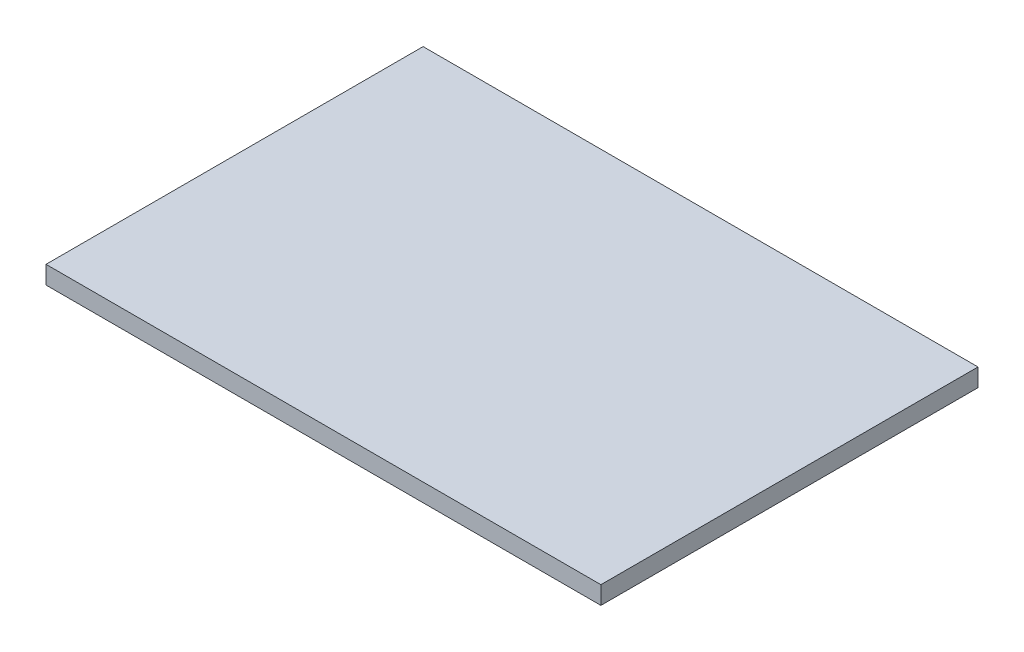
ISO-10303-21;
HEADER;
FILE_DESCRIPTION(('STEP AP214'),'2;1');
FILE_NAME('part.step','',(''),(''),'','','');
FILE_SCHEMA(('AUTOMOTIVE_DESIGN { 1 0 10303 214 1 1 1 1 }'));
ENDSEC;
DATA;
#1=APPLICATION_CONTEXT('core data for automotive mechanical design processes');
#2=APPLICATION_PROTOCOL_DEFINITION('international standard','automotive_design',2000,#1);
#3=PRODUCT_CONTEXT('',#1,'mechanical');
#4=PRODUCT('Part','Part','',(#3));
#5=PRODUCT_RELATED_PRODUCT_CATEGORY('part','',(#4));
#6=PRODUCT_DEFINITION_FORMATION('','',#4);
#7=PRODUCT_DEFINITION_CONTEXT('part definition',#1,'design');
#8=PRODUCT_DEFINITION('design','',#6,#7);
#9=PRODUCT_DEFINITION_SHAPE('','',#8);
#10=(LENGTH_UNIT() NAMED_UNIT(*) SI_UNIT(.MILLI.,.METRE.));
#11=(NAMED_UNIT(*) PLANE_ANGLE_UNIT() SI_UNIT($,.RADIAN.));
#12=(NAMED_UNIT(*) SI_UNIT($,.STERADIAN.) SOLID_ANGLE_UNIT());
#13=UNCERTAINTY_MEASURE_WITH_UNIT(LENGTH_MEASURE(1.E-05),#10,'distance_accuracy_value','');
#14=(GEOMETRIC_REPRESENTATION_CONTEXT(3) GLOBAL_UNCERTAINTY_ASSIGNED_CONTEXT((#13)) GLOBAL_UNIT_ASSIGNED_CONTEXT((#10,
#11,#12)) REPRESENTATION_CONTEXT('',''));
#15=CARTESIAN_POINT('',(0.,0.,0.));
#16=DIRECTION('',(0.,0.,1.));
#17=DIRECTION('',(1.,0.,0.));
#18=AXIS2_PLACEMENT_3D('',#15,#16,#17);
#19=CARTESIAN_POINT('',(0.,10.,0.));
#20=DIRECTION('',(1.,0.,0.));
#21=DIRECTION('',(0.,0.,-1.));
#22=AXIS2_PLACEMENT_3D('',#19,#20,#21);
#23=PLANE('',#22);
#24=DIRECTION('',(0.,0.,1.));
#25=VECTOR('',#24,1.);
#26=CARTESIAN_POINT('',(0.,0.,0.));
#27=LINE('',#26,#25);
#28=CARTESIAN_POINT('',(0.,0.,-210.));
#29=VERTEX_POINT('',#28);
#30=CARTESIAN_POINT('',(0.,0.,0.));
#31=VERTEX_POINT('',#30);
#32=EDGE_CURVE('E107',#29,#31,#27,.T.);
#33=ORIENTED_EDGE('',*,*,#32,.T.);
#34=DIRECTION('',(0.,-1.,0.));
#35=VECTOR('',#34,1.);
#36=CARTESIAN_POINT('',(0.,10.,0.));
#37=LINE('',#36,#35);
#38=CARTESIAN_POINT('',(0.,10.,0.));
#39=VERTEX_POINT('',#38);
#40=EDGE_CURVE('E11',#39,#31,#37,.T.);
#41=ORIENTED_EDGE('',*,*,#40,.F.);
#42=DIRECTION('',(0.,0.,1.));
#43=VECTOR('',#42,1.);
#44=CARTESIAN_POINT('',(0.,10.,0.));
#45=LINE('',#44,#43);
#46=CARTESIAN_POINT('',(0.,10.,-210.));
#47=VERTEX_POINT('',#46);
#48=EDGE_CURVE('E91',#47,#39,#45,.T.);
#49=ORIENTED_EDGE('',*,*,#48,.F.);
#50=DIRECTION('',(0.,-1.,0.));
#51=VECTOR('',#50,1.);
#52=CARTESIAN_POINT('',(0.,10.,-210.));
#53=LINE('',#52,#51);
#54=EDGE_CURVE('E103',#47,#29,#53,.T.);
#55=ORIENTED_EDGE('',*,*,#54,.T.);
#56=EDGE_LOOP('',(#33,#41,#49,#55));
#57=FACE_BOUND('',#56,.T.);
#58=ADVANCED_FACE('F39',(#57),#23,.F.);
#59=CARTESIAN_POINT('',(0.,10.,0.));
#60=DIRECTION('',(0.,0.,-1.));
#61=DIRECTION('',(-1.,0.,0.));
#62=AXIS2_PLACEMENT_3D('',#59,#60,#61);
#63=PLANE('',#62);
#64=DIRECTION('',(1.,0.,0.));
#65=VECTOR('',#64,1.);
#66=CARTESIAN_POINT('',(0.,0.,0.));
#67=LINE('',#66,#65);
#68=CARTESIAN_POINT('',(309.,0.,0.));
#69=VERTEX_POINT('',#68);
#70=EDGE_CURVE('E96',#31,#69,#67,.T.);
#71=ORIENTED_EDGE('',*,*,#70,.T.);
#72=DIRECTION('',(0.,-1.,0.));
#73=VECTOR('',#72,1.);
#74=CARTESIAN_POINT('',(309.,10.,0.));
#75=LINE('',#74,#73);
#76=CARTESIAN_POINT('',(309.,10.,0.));
#77=VERTEX_POINT('',#76);
#78=EDGE_CURVE('E48',#77,#69,#75,.T.);
#79=ORIENTED_EDGE('',*,*,#78,.F.);
#80=DIRECTION('',(1.,0.,0.));
#81=VECTOR('',#80,1.);
#82=CARTESIAN_POINT('',(0.,10.,0.));
#83=LINE('',#82,#81);
#84=EDGE_CURVE('E86',#39,#77,#83,.T.);
#85=ORIENTED_EDGE('',*,*,#84,.F.);
#86=ORIENTED_EDGE('',*,*,#40,.T.);
#87=EDGE_LOOP('',(#71,#79,#85,#86));
#88=FACE_BOUND('',#87,.T.);
#89=ADVANCED_FACE('F95',(#88),#63,.F.);
#90=CARTESIAN_POINT('',(309.,10.,0.));
#91=DIRECTION('',(-1.,0.,0.));
#92=DIRECTION('',(0.,0.,1.));
#93=AXIS2_PLACEMENT_3D('',#90,#91,#92);
#94=PLANE('',#93);
#95=DIRECTION('',(0.,0.,-1.));
#96=VECTOR('',#95,1.);
#97=CARTESIAN_POINT('',(309.,0.,0.));
#98=LINE('',#97,#96);
#99=CARTESIAN_POINT('',(309.,0.,-210.));
#100=VERTEX_POINT('',#99);
#101=EDGE_CURVE('E73',#69,#100,#98,.T.);
#102=ORIENTED_EDGE('',*,*,#101,.T.);
#103=DIRECTION('',(0.,-1.,0.));
#104=VECTOR('',#103,1.);
#105=CARTESIAN_POINT('',(309.,10.,-210.));
#106=LINE('',#105,#104);
#107=CARTESIAN_POINT('',(309.,10.,-210.));
#108=VERTEX_POINT('',#107);
#109=EDGE_CURVE('E98',#108,#100,#106,.T.);
#110=ORIENTED_EDGE('',*,*,#109,.F.);
#111=DIRECTION('',(0.,0.,-1.));
#112=VECTOR('',#111,1.);
#113=CARTESIAN_POINT('',(309.,10.,0.));
#114=LINE('',#113,#112);
#115=EDGE_CURVE('E89',#77,#108,#114,.T.);
#116=ORIENTED_EDGE('',*,*,#115,.F.);
#117=ORIENTED_EDGE('',*,*,#78,.T.);
#118=EDGE_LOOP('',(#102,#110,#116,#117));
#119=FACE_BOUND('',#118,.T.);
#120=ADVANCED_FACE('F99',(#119),#94,.F.);
#121=CARTESIAN_POINT('',(0.,10.,-210.));
#122=DIRECTION('',(0.,0.,1.));
#123=DIRECTION('',(1.,0.,0.));
#124=AXIS2_PLACEMENT_3D('',#121,#122,#123);
#125=PLANE('',#124);
#126=DIRECTION('',(-1.,0.,0.));
#127=VECTOR('',#126,1.);
#128=CARTESIAN_POINT('',(0.,0.,-210.));
#129=LINE('',#128,#127);
#130=EDGE_CURVE('E79',#100,#29,#129,.T.);
#131=ORIENTED_EDGE('',*,*,#130,.T.);
#132=ORIENTED_EDGE('',*,*,#54,.F.);
#133=DIRECTION('',(-1.,0.,0.));
#134=VECTOR('',#133,1.);
#135=CARTESIAN_POINT('',(0.,10.,-210.));
#136=LINE('',#135,#134);
#137=EDGE_CURVE('E56',#108,#47,#136,.T.);
#138=ORIENTED_EDGE('',*,*,#137,.F.);
#139=ORIENTED_EDGE('',*,*,#109,.T.);
#140=EDGE_LOOP('',(#131,#132,#138,#139));
#141=FACE_BOUND('',#140,.T.);
#142=ADVANCED_FACE('F120',(#141),#125,.F.);
#143=CARTESIAN_POINT('',(0.,10.,0.));
#144=DIRECTION('',(0.,-1.,0.));
#145=DIRECTION('',(0.,0.,-1.));
#146=AXIS2_PLACEMENT_3D('',#143,#144,#145);
#147=PLANE('',#146);
#148=ORIENTED_EDGE('',*,*,#48,.T.);
#149=ORIENTED_EDGE('',*,*,#84,.T.);
#150=ORIENTED_EDGE('',*,*,#115,.T.);
#151=ORIENTED_EDGE('',*,*,#137,.T.);
#152=EDGE_LOOP('',(#148,#149,#150,#151));
#153=FACE_BOUND('',#152,.T.);
#154=ADVANCED_FACE('F87',(#153),#147,.F.);
#155=CARTESIAN_POINT('',(0.,0.,0.));
#156=DIRECTION('',(0.,-1.,0.));
#157=DIRECTION('',(0.,0.,-1.));
#158=AXIS2_PLACEMENT_3D('',#155,#156,#157);
#159=PLANE('',#158);
#160=ORIENTED_EDGE('',*,*,#32,.F.);
#161=ORIENTED_EDGE('',*,*,#130,.F.);
#162=ORIENTED_EDGE('',*,*,#101,.F.);
#163=ORIENTED_EDGE('',*,*,#70,.F.);
#164=EDGE_LOOP('',(#160,#161,#162,#163));
#165=FACE_BOUND('',#164,.T.);
#166=ADVANCED_FACE('F123',(#165),#159,.T.);
#167=CLOSED_SHELL('',(#58,#89,#120,#142,#154,#166));
#168=MANIFOLD_SOLID_BREP('B2',#167);
#169=ADVANCED_BREP_SHAPE_REPRESENTATION('',(#18,#168),#14);
#170=SHAPE_DEFINITION_REPRESENTATION(#9,#169);
ENDSEC;
END-ISO-10303-21;
